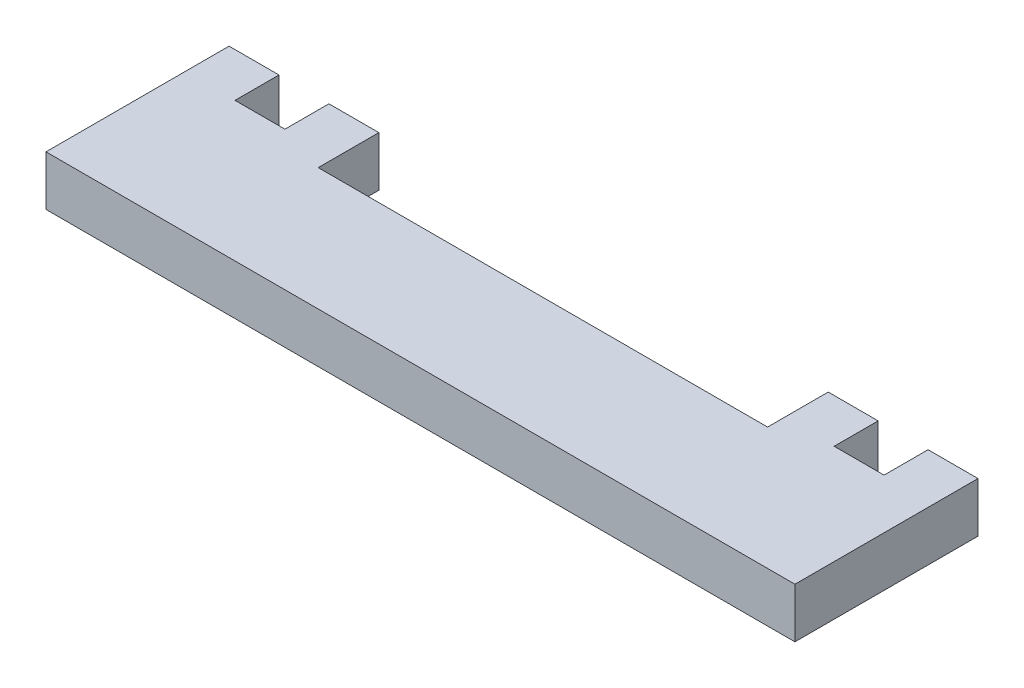
ISO-10303-21;
HEADER;
FILE_DESCRIPTION(('STEP AP214'),'2;1');
FILE_NAME('part.step','',(''),(''),'','','');
FILE_SCHEMA(('AUTOMOTIVE_DESIGN { 1 0 10303 214 1 1 1 1 }'));
ENDSEC;
DATA;
#1=APPLICATION_CONTEXT('core data for automotive mechanical design processes');
#2=APPLICATION_PROTOCOL_DEFINITION('international standard','automotive_design',2000,#1);
#3=PRODUCT_CONTEXT('',#1,'mechanical');
#4=PRODUCT('Part','Part','',(#3));
#5=PRODUCT_RELATED_PRODUCT_CATEGORY('part','',(#4));
#6=PRODUCT_DEFINITION_FORMATION('','',#4);
#7=PRODUCT_DEFINITION_CONTEXT('part definition',#1,'design');
#8=PRODUCT_DEFINITION('design','',#6,#7);
#9=PRODUCT_DEFINITION_SHAPE('','',#8);
#10=(LENGTH_UNIT() NAMED_UNIT(*) SI_UNIT(.MILLI.,.METRE.));
#11=(NAMED_UNIT(*) PLANE_ANGLE_UNIT() SI_UNIT($,.RADIAN.));
#12=(NAMED_UNIT(*) SI_UNIT($,.STERADIAN.) SOLID_ANGLE_UNIT());
#13=UNCERTAINTY_MEASURE_WITH_UNIT(LENGTH_MEASURE(1.E-05),#10,'distance_accuracy_value','');
#14=(GEOMETRIC_REPRESENTATION_CONTEXT(3) GLOBAL_UNCERTAINTY_ASSIGNED_CONTEXT((#13)) GLOBAL_UNIT_ASSIGNED_CONTEXT((#10,
#11,#12)) REPRESENTATION_CONTEXT('',''));
#15=CARTESIAN_POINT('',(0.,0.,0.));
#16=DIRECTION('',(0.,0.,1.));
#17=DIRECTION('',(1.,0.,0.));
#18=AXIS2_PLACEMENT_3D('',#15,#16,#17);
#19=CARTESIAN_POINT('',(13.5,3.,0.));
#20=DIRECTION('',(-1.,0.,0.));
#21=DIRECTION('',(0.,0.,1.));
#22=AXIS2_PLACEMENT_3D('',#19,#20,#21);
#23=PLANE('',#22);
#24=DIRECTION('',(0.,0.,-1.));
#25=VECTOR('',#24,1.);
#26=CARTESIAN_POINT('',(13.5,0.,0.));
#27=LINE('',#26,#25);
#28=CARTESIAN_POINT('',(13.5,0.,-3.35638413828951));
#29=VERTEX_POINT('',#28);
#30=CARTESIAN_POINT('',(13.5,0.,-7.00000000000001));
#31=VERTEX_POINT('',#30);
#32=EDGE_CURVE('E176',#29,#31,#27,.T.);
#33=ORIENTED_EDGE('',*,*,#32,.F.);
#34=DIRECTION('',(0.,-1.,0.));
#35=VECTOR('',#34,1.);
#36=CARTESIAN_POINT('',(13.5,3.,-3.35638413828951));
#37=LINE('',#36,#35);
#38=CARTESIAN_POINT('',(13.5,3.,-3.35638413828951));
#39=VERTEX_POINT('',#38);
#40=EDGE_CURVE('E11',#39,#29,#37,.T.);
#41=ORIENTED_EDGE('',*,*,#40,.F.);
#42=DIRECTION('',(0.,0.,-1.));
#43=VECTOR('',#42,1.);
#44=CARTESIAN_POINT('',(13.5,3.,0.));
#45=LINE('',#44,#43);
#46=CARTESIAN_POINT('',(13.5,3.,-7.00000000000001));
#47=VERTEX_POINT('',#46);
#48=EDGE_CURVE('E217',#39,#47,#45,.T.);
#49=ORIENTED_EDGE('',*,*,#48,.T.);
#50=DIRECTION('',(0.,-1.,0.));
#51=VECTOR('',#50,1.);
#52=CARTESIAN_POINT('',(13.5,3.,-7.00000000000001));
#53=LINE('',#52,#51);
#54=EDGE_CURVE('E109',#47,#31,#53,.T.);
#55=ORIENTED_EDGE('',*,*,#54,.T.);
#56=EDGE_LOOP('',(#33,#41,#49,#55));
#57=FACE_BOUND('',#56,.T.);
#58=ADVANCED_FACE('F35',(#57),#23,.T.);
#59=CARTESIAN_POINT('',(0.,3.,-3.35638413828951));
#60=DIRECTION('',(0.,0.,-1.));
#61=DIRECTION('',(-1.,0.,0.));
#62=AXIS2_PLACEMENT_3D('',#59,#60,#61);
#63=PLANE('',#62);
#64=DIRECTION('',(1.,0.,0.));
#65=VECTOR('',#64,1.);
#66=CARTESIAN_POINT('',(0.,0.,-3.35638413828951));
#67=LINE('',#66,#65);
#68=CARTESIAN_POINT('',(-13.5,0.,-3.35638413828951));
#69=VERTEX_POINT('',#68);
#70=EDGE_CURVE('E179',#69,#29,#67,.T.);
#71=ORIENTED_EDGE('',*,*,#70,.F.);
#72=DIRECTION('',(0.,-1.,0.));
#73=VECTOR('',#72,1.);
#74=CARTESIAN_POINT('',(-13.5,3.,-3.35638413828951));
#75=LINE('',#74,#73);
#76=CARTESIAN_POINT('',(-13.5,3.,-3.35638413828951));
#77=VERTEX_POINT('',#76);
#78=EDGE_CURVE('E43',#77,#69,#75,.T.);
#79=ORIENTED_EDGE('',*,*,#78,.F.);
#80=DIRECTION('',(1.,0.,0.));
#81=VECTOR('',#80,1.);
#82=CARTESIAN_POINT('',(0.,3.,-3.35638413828951));
#83=LINE('',#82,#81);
#84=EDGE_CURVE('E264',#77,#39,#83,.T.);
#85=ORIENTED_EDGE('',*,*,#84,.T.);
#86=ORIENTED_EDGE('',*,*,#40,.T.);
#87=EDGE_LOOP('',(#71,#79,#85,#86));
#88=FACE_BOUND('',#87,.T.);
#89=ADVANCED_FACE('F252',(#88),#63,.T.);
#90=CARTESIAN_POINT('',(-13.5,3.,0.));
#91=DIRECTION('',(1.,0.,0.));
#92=DIRECTION('',(0.,0.,-1.));
#93=AXIS2_PLACEMENT_3D('',#90,#91,#92);
#94=PLANE('',#93);
#95=DIRECTION('',(0.,0.,1.));
#96=VECTOR('',#95,1.);
#97=CARTESIAN_POINT('',(-13.5,0.,0.));
#98=LINE('',#97,#96);
#99=CARTESIAN_POINT('',(-13.5,0.,-7.00000000000001));
#100=VERTEX_POINT('',#99);
#101=EDGE_CURVE('E182',#100,#69,#98,.T.);
#102=ORIENTED_EDGE('',*,*,#101,.F.);
#103=DIRECTION('',(0.,-1.,0.));
#104=VECTOR('',#103,1.);
#105=CARTESIAN_POINT('',(-13.5,3.,-7.00000000000001));
#106=LINE('',#105,#104);
#107=CARTESIAN_POINT('',(-13.5,3.,-7.00000000000001));
#108=VERTEX_POINT('',#107);
#109=EDGE_CURVE('E241',#108,#100,#106,.T.);
#110=ORIENTED_EDGE('',*,*,#109,.F.);
#111=DIRECTION('',(0.,0.,1.));
#112=VECTOR('',#111,1.);
#113=CARTESIAN_POINT('',(-13.5,3.,0.));
#114=LINE('',#113,#112);
#115=EDGE_CURVE('E248',#108,#77,#114,.T.);
#116=ORIENTED_EDGE('',*,*,#115,.T.);
#117=ORIENTED_EDGE('',*,*,#78,.T.);
#118=EDGE_LOOP('',(#102,#110,#116,#117));
#119=FACE_BOUND('',#118,.T.);
#120=ADVANCED_FACE('F246',(#119),#94,.T.);
#121=CARTESIAN_POINT('',(0.,3.,-7.00000000000001));
#122=DIRECTION('',(0.,0.,-1.));
#123=DIRECTION('',(-1.,0.,0.));
#124=AXIS2_PLACEMENT_3D('',#121,#122,#123);
#125=PLANE('',#124);
#126=DIRECTION('',(1.,0.,0.));
#127=VECTOR('',#126,1.);
#128=CARTESIAN_POINT('',(0.,0.,-7.00000000000001));
#129=LINE('',#128,#127);
#130=CARTESIAN_POINT('',(-16.5,0.,-7.00000000000001));
#131=VERTEX_POINT('',#130);
#132=EDGE_CURVE('E185',#131,#100,#129,.T.);
#133=ORIENTED_EDGE('',*,*,#132,.F.);
#134=DIRECTION('',(0.,-1.,0.));
#135=VECTOR('',#134,1.);
#136=CARTESIAN_POINT('',(-16.5,3.,-7.00000000000001));
#137=LINE('',#136,#135);
#138=CARTESIAN_POINT('',(-16.5,3.,-7.00000000000001));
#139=VERTEX_POINT('',#138);
#140=EDGE_CURVE('E239',#139,#131,#137,.T.);
#141=ORIENTED_EDGE('',*,*,#140,.F.);
#142=DIRECTION('',(1.,0.,0.));
#143=VECTOR('',#142,1.);
#144=CARTESIAN_POINT('',(0.,3.,-7.00000000000001));
#145=LINE('',#144,#143);
#146=EDGE_CURVE('E261',#139,#108,#145,.T.);
#147=ORIENTED_EDGE('',*,*,#146,.T.);
#148=ORIENTED_EDGE('',*,*,#109,.T.);
#149=EDGE_LOOP('',(#133,#141,#147,#148));
#150=FACE_BOUND('',#149,.T.);
#151=ADVANCED_FACE('F258',(#150),#125,.T.);
#152=CARTESIAN_POINT('',(-16.5,3.,0.));
#153=DIRECTION('',(-1.,0.,0.));
#154=DIRECTION('',(0.,0.,1.));
#155=AXIS2_PLACEMENT_3D('',#152,#153,#154);
#156=PLANE('',#155);
#157=DIRECTION('',(0.,0.,-1.));
#158=VECTOR('',#157,1.);
#159=CARTESIAN_POINT('',(-16.5,0.,0.));
#160=LINE('',#159,#158);
#161=CARTESIAN_POINT('',(-16.5,0.,-4.35638413828951));
#162=VERTEX_POINT('',#161);
#163=EDGE_CURVE('E188',#162,#131,#160,.T.);
#164=ORIENTED_EDGE('',*,*,#163,.F.);
#165=DIRECTION('',(0.,-1.,0.));
#166=VECTOR('',#165,1.);
#167=CARTESIAN_POINT('',(-16.5,3.,-4.35638413828951));
#168=LINE('',#167,#166);
#169=CARTESIAN_POINT('',(-16.5,3.,-4.35638413828951));
#170=VERTEX_POINT('',#169);
#171=EDGE_CURVE('E237',#170,#162,#168,.T.);
#172=ORIENTED_EDGE('',*,*,#171,.F.);
#173=DIRECTION('',(0.,0.,-1.));
#174=VECTOR('',#173,1.);
#175=CARTESIAN_POINT('',(-16.5,3.,0.));
#176=LINE('',#175,#174);
#177=EDGE_CURVE('E266',#170,#139,#176,.T.);
#178=ORIENTED_EDGE('',*,*,#177,.T.);
#179=ORIENTED_EDGE('',*,*,#140,.T.);
#180=EDGE_LOOP('',(#164,#172,#178,#179));
#181=FACE_BOUND('',#180,.T.);
#182=ADVANCED_FACE('F310',(#181),#156,.T.);
#183=CARTESIAN_POINT('',(0.,3.,-4.35638413828951));
#184=DIRECTION('',(0.,0.,-1.));
#185=DIRECTION('',(-1.,0.,0.));
#186=AXIS2_PLACEMENT_3D('',#183,#184,#185);
#187=PLANE('',#186);
#188=DIRECTION('',(1.,0.,0.));
#189=VECTOR('',#188,1.);
#190=CARTESIAN_POINT('',(0.,0.,-4.35638413828951));
#191=LINE('',#190,#189);
#192=CARTESIAN_POINT('',(-19.5,0.,-4.35638413828951));
#193=VERTEX_POINT('',#192);
#194=EDGE_CURVE('E191',#193,#162,#191,.T.);
#195=ORIENTED_EDGE('',*,*,#194,.F.);
#196=DIRECTION('',(0.,-1.,0.));
#197=VECTOR('',#196,1.);
#198=CARTESIAN_POINT('',(-19.5,3.,-4.35638413828951));
#199=LINE('',#198,#197);
#200=CARTESIAN_POINT('',(-19.5,3.,-4.35638413828951));
#201=VERTEX_POINT('',#200);
#202=EDGE_CURVE('E235',#201,#193,#199,.T.);
#203=ORIENTED_EDGE('',*,*,#202,.F.);
#204=DIRECTION('',(1.,0.,0.));
#205=VECTOR('',#204,1.);
#206=CARTESIAN_POINT('',(0.,3.,-4.35638413828951));
#207=LINE('',#206,#205);
#208=EDGE_CURVE('E272',#201,#170,#207,.T.);
#209=ORIENTED_EDGE('',*,*,#208,.T.);
#210=ORIENTED_EDGE('',*,*,#171,.T.);
#211=EDGE_LOOP('',(#195,#203,#209,#210));
#212=FACE_BOUND('',#211,.T.);
#213=ADVANCED_FACE('F313',(#212),#187,.T.);
#214=CARTESIAN_POINT('',(-19.5,3.,0.));
#215=DIRECTION('',(-1.,0.,0.));
#216=DIRECTION('',(0.,0.,1.));
#217=AXIS2_PLACEMENT_3D('',#214,#215,#216);
#218=PLANE('',#217);
#219=DIRECTION('',(0.,0.,-1.));
#220=VECTOR('',#219,1.);
#221=CARTESIAN_POINT('',(-19.5,0.,0.));
#222=LINE('',#221,#220);
#223=CARTESIAN_POINT('',(-19.5,0.,-7.00000000000001));
#224=VERTEX_POINT('',#223);
#225=EDGE_CURVE('E194',#193,#224,#222,.T.);
#226=ORIENTED_EDGE('',*,*,#225,.T.);
#227=DIRECTION('',(0.,-1.,0.));
#228=VECTOR('',#227,1.);
#229=CARTESIAN_POINT('',(-19.5,3.,-7.00000000000001));
#230=LINE('',#229,#228);
#231=CARTESIAN_POINT('',(-19.5,3.,-7.00000000000001));
#232=VERTEX_POINT('',#231);
#233=EDGE_CURVE('E233',#232,#224,#230,.T.);
#234=ORIENTED_EDGE('',*,*,#233,.F.);
#235=DIRECTION('',(0.,0.,-1.));
#236=VECTOR('',#235,1.);
#237=CARTESIAN_POINT('',(-19.5,3.,0.));
#238=LINE('',#237,#236);
#239=EDGE_CURVE('E275',#201,#232,#238,.T.);
#240=ORIENTED_EDGE('',*,*,#239,.F.);
#241=ORIENTED_EDGE('',*,*,#202,.T.);
#242=EDGE_LOOP('',(#226,#234,#240,#241));
#243=FACE_BOUND('',#242,.T.);
#244=ADVANCED_FACE('F317',(#243),#218,.F.);
#245=CARTESIAN_POINT('',(0.,3.,-7.00000000000001));
#246=DIRECTION('',(0.,0.,-1.));
#247=DIRECTION('',(-1.,0.,0.));
#248=AXIS2_PLACEMENT_3D('',#245,#246,#247);
#249=PLANE('',#248);
#250=DIRECTION('',(1.,0.,0.));
#251=VECTOR('',#250,1.);
#252=CARTESIAN_POINT('',(0.,0.,-7.00000000000001));
#253=LINE('',#252,#251);
#254=CARTESIAN_POINT('',(-22.5,0.,-7.00000000000001));
#255=VERTEX_POINT('',#254);
#256=EDGE_CURVE('E197',#255,#224,#253,.T.);
#257=ORIENTED_EDGE('',*,*,#256,.F.);
#258=DIRECTION('',(0.,-1.,0.));
#259=VECTOR('',#258,1.);
#260=CARTESIAN_POINT('',(-22.5,3.,-7.00000000000001));
#261=LINE('',#260,#259);
#262=CARTESIAN_POINT('',(-22.5,3.,-7.00000000000001));
#263=VERTEX_POINT('',#262);
#264=EDGE_CURVE('E231',#263,#255,#261,.T.);
#265=ORIENTED_EDGE('',*,*,#264,.F.);
#266=DIRECTION('',(1.,0.,0.));
#267=VECTOR('',#266,1.);
#268=CARTESIAN_POINT('',(0.,3.,-7.00000000000001));
#269=LINE('',#268,#267);
#270=EDGE_CURVE('E277',#263,#232,#269,.T.);
#271=ORIENTED_EDGE('',*,*,#270,.T.);
#272=ORIENTED_EDGE('',*,*,#233,.T.);
#273=EDGE_LOOP('',(#257,#265,#271,#272));
#274=FACE_BOUND('',#273,.T.);
#275=ADVANCED_FACE('F321',(#274),#249,.T.);
#276=CARTESIAN_POINT('',(-22.5,3.,0.));
#277=DIRECTION('',(-1.,0.,0.));
#278=DIRECTION('',(0.,0.,1.));
#279=AXIS2_PLACEMENT_3D('',#276,#277,#278);
#280=PLANE('',#279);
#281=DIRECTION('',(0.,0.,-1.));
#282=VECTOR('',#281,1.);
#283=CARTESIAN_POINT('',(-22.5,0.,0.));
#284=LINE('',#283,#282);
#285=CARTESIAN_POINT('',(-22.5,0.,3.99999999999999));
#286=VERTEX_POINT('',#285);
#287=EDGE_CURVE('E200',#286,#255,#284,.T.);
#288=ORIENTED_EDGE('',*,*,#287,.F.);
#289=DIRECTION('',(0.,-1.,0.));
#290=VECTOR('',#289,1.);
#291=CARTESIAN_POINT('',(-22.5,3.,3.99999999999999));
#292=LINE('',#291,#290);
#293=CARTESIAN_POINT('',(-22.5,3.,3.99999999999999));
#294=VERTEX_POINT('',#293);
#295=EDGE_CURVE('E229',#294,#286,#292,.T.);
#296=ORIENTED_EDGE('',*,*,#295,.F.);
#297=DIRECTION('',(0.,0.,-1.));
#298=VECTOR('',#297,1.);
#299=CARTESIAN_POINT('',(-22.5,3.,0.));
#300=LINE('',#299,#298);
#301=EDGE_CURVE('E280',#294,#263,#300,.T.);
#302=ORIENTED_EDGE('',*,*,#301,.T.);
#303=ORIENTED_EDGE('',*,*,#264,.T.);
#304=EDGE_LOOP('',(#288,#296,#302,#303));
#305=FACE_BOUND('',#304,.T.);
#306=ADVANCED_FACE('F325',(#305),#280,.T.);
#307=CARTESIAN_POINT('',(0.,3.,4.));
#308=DIRECTION('',(0.,0.,-1.));
#309=DIRECTION('',(-1.,0.,0.));
#310=AXIS2_PLACEMENT_3D('',#307,#308,#309);
#311=PLANE('',#310);
#312=DIRECTION('',(1.,0.,0.));
#313=VECTOR('',#312,1.);
#314=CARTESIAN_POINT('',(0.,0.,4.));
#315=LINE('',#314,#313);
#316=CARTESIAN_POINT('',(22.5,0.,4.00000000000001));
#317=VERTEX_POINT('',#316);
#318=EDGE_CURVE('E203',#286,#317,#315,.T.);
#319=ORIENTED_EDGE('',*,*,#318,.T.);
#320=DIRECTION('',(0.,-1.,0.));
#321=VECTOR('',#320,1.);
#322=CARTESIAN_POINT('',(22.5,3.,4.00000000000001));
#323=LINE('',#322,#321);
#324=CARTESIAN_POINT('',(22.5,3.,4.00000000000001));
#325=VERTEX_POINT('',#324);
#326=EDGE_CURVE('E226',#325,#317,#323,.T.);
#327=ORIENTED_EDGE('',*,*,#326,.F.);
#328=DIRECTION('',(1.,0.,0.));
#329=VECTOR('',#328,1.);
#330=CARTESIAN_POINT('',(0.,3.,4.));
#331=LINE('',#330,#329);
#332=EDGE_CURVE('E283',#294,#325,#331,.T.);
#333=ORIENTED_EDGE('',*,*,#332,.F.);
#334=ORIENTED_EDGE('',*,*,#295,.T.);
#335=EDGE_LOOP('',(#319,#327,#333,#334));
#336=FACE_BOUND('',#335,.T.);
#337=ADVANCED_FACE('F329',(#336),#311,.F.);
#338=CARTESIAN_POINT('',(22.5,3.,0.));
#339=DIRECTION('',(-1.,0.,0.));
#340=DIRECTION('',(0.,0.,1.));
#341=AXIS2_PLACEMENT_3D('',#338,#339,#340);
#342=PLANE('',#341);
#343=DIRECTION('',(0.,0.,-1.));
#344=VECTOR('',#343,1.);
#345=CARTESIAN_POINT('',(22.5,0.,0.));
#346=LINE('',#345,#344);
#347=CARTESIAN_POINT('',(22.5,0.,-7.00000000000001));
#348=VERTEX_POINT('',#347);
#349=EDGE_CURVE('E205',#317,#348,#346,.T.);
#350=ORIENTED_EDGE('',*,*,#349,.T.);
#351=DIRECTION('',(0.,-1.,0.));
#352=VECTOR('',#351,1.);
#353=CARTESIAN_POINT('',(22.5,3.,-7.00000000000001));
#354=LINE('',#353,#352);
#355=CARTESIAN_POINT('',(22.5,3.,-7.00000000000001));
#356=VERTEX_POINT('',#355);
#357=EDGE_CURVE('E223',#356,#348,#354,.T.);
#358=ORIENTED_EDGE('',*,*,#357,.F.);
#359=DIRECTION('',(0.,0.,-1.));
#360=VECTOR('',#359,1.);
#361=CARTESIAN_POINT('',(22.5,3.,0.));
#362=LINE('',#361,#360);
#363=EDGE_CURVE('E285',#325,#356,#362,.T.);
#364=ORIENTED_EDGE('',*,*,#363,.F.);
#365=ORIENTED_EDGE('',*,*,#326,.T.);
#366=EDGE_LOOP('',(#350,#358,#364,#365));
#367=FACE_BOUND('',#366,.T.);
#368=ADVANCED_FACE('F333',(#367),#342,.F.);
#369=CARTESIAN_POINT('',(0.,3.,-7.00000000000001));
#370=DIRECTION('',(0.,0.,1.));
#371=DIRECTION('',(1.,0.,0.));
#372=AXIS2_PLACEMENT_3D('',#369,#370,#371);
#373=PLANE('',#372);
#374=DIRECTION('',(-1.,0.,0.));
#375=VECTOR('',#374,1.);
#376=CARTESIAN_POINT('',(0.,0.,-7.00000000000001));
#377=LINE('',#376,#375);
#378=CARTESIAN_POINT('',(19.5,0.,-7.00000000000001));
#379=VERTEX_POINT('',#378);
#380=EDGE_CURVE('E207',#348,#379,#377,.T.);
#381=ORIENTED_EDGE('',*,*,#380,.T.);
#382=DIRECTION('',(0.,-1.,0.));
#383=VECTOR('',#382,1.);
#384=CARTESIAN_POINT('',(19.5,3.,-7.00000000000001));
#385=LINE('',#384,#383);
#386=CARTESIAN_POINT('',(19.5,3.,-7.00000000000001));
#387=VERTEX_POINT('',#386);
#388=EDGE_CURVE('E221',#387,#379,#385,.T.);
#389=ORIENTED_EDGE('',*,*,#388,.F.);
#390=DIRECTION('',(-1.,0.,0.));
#391=VECTOR('',#390,1.);
#392=CARTESIAN_POINT('',(0.,3.,-7.00000000000001));
#393=LINE('',#392,#391);
#394=EDGE_CURVE('E171',#356,#387,#393,.T.);
#395=ORIENTED_EDGE('',*,*,#394,.F.);
#396=ORIENTED_EDGE('',*,*,#357,.T.);
#397=EDGE_LOOP('',(#381,#389,#395,#396));
#398=FACE_BOUND('',#397,.T.);
#399=ADVANCED_FACE('F291',(#398),#373,.F.);
#400=CARTESIAN_POINT('',(19.5,3.,0.));
#401=DIRECTION('',(-1.,0.,0.));
#402=DIRECTION('',(0.,0.,1.));
#403=AXIS2_PLACEMENT_3D('',#400,#401,#402);
#404=PLANE('',#403);
#405=DIRECTION('',(0.,0.,-1.));
#406=VECTOR('',#405,1.);
#407=CARTESIAN_POINT('',(19.5,0.,0.));
#408=LINE('',#407,#406);
#409=CARTESIAN_POINT('',(19.5,0.,-4.35638413828951));
#410=VERTEX_POINT('',#409);
#411=EDGE_CURVE('E210',#410,#379,#408,.T.);
#412=ORIENTED_EDGE('',*,*,#411,.F.);
#413=DIRECTION('',(0.,-1.,0.));
#414=VECTOR('',#413,1.);
#415=CARTESIAN_POINT('',(19.5,3.,-4.35638413828951));
#416=LINE('',#415,#414);
#417=CARTESIAN_POINT('',(19.5,3.,-4.35638413828951));
#418=VERTEX_POINT('',#417);
#419=EDGE_CURVE('E160',#418,#410,#416,.T.);
#420=ORIENTED_EDGE('',*,*,#419,.F.);
#421=DIRECTION('',(0.,0.,-1.));
#422=VECTOR('',#421,1.);
#423=CARTESIAN_POINT('',(19.5,3.,0.));
#424=LINE('',#423,#422);
#425=EDGE_CURVE('E169',#418,#387,#424,.T.);
#426=ORIENTED_EDGE('',*,*,#425,.T.);
#427=ORIENTED_EDGE('',*,*,#388,.T.);
#428=EDGE_LOOP('',(#412,#420,#426,#427));
#429=FACE_BOUND('',#428,.T.);
#430=ADVANCED_FACE('F295',(#429),#404,.T.);
#431=CARTESIAN_POINT('',(0.,3.,-4.35638413828951));
#432=DIRECTION('',(0.,0.,-1.));
#433=DIRECTION('',(-1.,0.,0.));
#434=AXIS2_PLACEMENT_3D('',#431,#432,#433);
#435=PLANE('',#434);
#436=DIRECTION('',(1.,0.,0.));
#437=VECTOR('',#436,1.);
#438=CARTESIAN_POINT('',(0.,0.,-4.35638413828951));
#439=LINE('',#438,#437);
#440=CARTESIAN_POINT('',(16.5,0.,-4.35638413828951));
#441=VERTEX_POINT('',#440);
#442=EDGE_CURVE('E159',#441,#410,#439,.T.);
#443=ORIENTED_EDGE('',*,*,#442,.F.);
#444=DIRECTION('',(0.,-1.,0.));
#445=VECTOR('',#444,1.);
#446=CARTESIAN_POINT('',(16.5,3.,-4.35638413828951));
#447=LINE('',#446,#445);
#448=CARTESIAN_POINT('',(16.5,3.,-4.35638413828951));
#449=VERTEX_POINT('',#448);
#450=EDGE_CURVE('E153',#449,#441,#447,.T.);
#451=ORIENTED_EDGE('',*,*,#450,.F.);
#452=DIRECTION('',(1.,0.,0.));
#453=VECTOR('',#452,1.);
#454=CARTESIAN_POINT('',(0.,3.,-4.35638413828951));
#455=LINE('',#454,#453);
#456=EDGE_CURVE('E157',#449,#418,#455,.T.);
#457=ORIENTED_EDGE('',*,*,#456,.T.);
#458=ORIENTED_EDGE('',*,*,#419,.T.);
#459=EDGE_LOOP('',(#443,#451,#457,#458));
#460=FACE_BOUND('',#459,.T.);
#461=ADVANCED_FACE('F155',(#460),#435,.T.);
#462=CARTESIAN_POINT('',(16.5,3.,0.));
#463=DIRECTION('',(-1.,0.,0.));
#464=DIRECTION('',(0.,0.,1.));
#465=AXIS2_PLACEMENT_3D('',#462,#463,#464);
#466=PLANE('',#465);
#467=DIRECTION('',(0.,0.,-1.));
#468=VECTOR('',#467,1.);
#469=CARTESIAN_POINT('',(16.5,0.,0.));
#470=LINE('',#469,#468);
#471=CARTESIAN_POINT('',(16.5,0.,-7.00000000000001));
#472=VERTEX_POINT('',#471);
#473=EDGE_CURVE('E102',#441,#472,#470,.T.);
#474=ORIENTED_EDGE('',*,*,#473,.T.);
#475=DIRECTION('',(0.,-1.,0.));
#476=VECTOR('',#475,1.);
#477=CARTESIAN_POINT('',(16.5,3.,-7.00000000000001));
#478=LINE('',#477,#476);
#479=CARTESIAN_POINT('',(16.5,3.,-7.00000000000001));
#480=VERTEX_POINT('',#479);
#481=EDGE_CURVE('E161',#480,#472,#478,.T.);
#482=ORIENTED_EDGE('',*,*,#481,.F.);
#483=DIRECTION('',(0.,0.,-1.));
#484=VECTOR('',#483,1.);
#485=CARTESIAN_POINT('',(16.5,3.,0.));
#486=LINE('',#485,#484);
#487=EDGE_CURVE('E163',#449,#480,#486,.T.);
#488=ORIENTED_EDGE('',*,*,#487,.F.);
#489=ORIENTED_EDGE('',*,*,#450,.T.);
#490=EDGE_LOOP('',(#474,#482,#488,#489));
#491=FACE_BOUND('',#490,.T.);
#492=ADVANCED_FACE('F164',(#491),#466,.F.);
#493=CARTESIAN_POINT('',(0.,3.,-7.00000000000001));
#494=DIRECTION('',(0.,0.,1.));
#495=DIRECTION('',(1.,0.,0.));
#496=AXIS2_PLACEMENT_3D('',#493,#494,#495);
#497=PLANE('',#496);
#498=DIRECTION('',(-1.,0.,0.));
#499=VECTOR('',#498,1.);
#500=CARTESIAN_POINT('',(0.,0.,-7.00000000000001));
#501=LINE('',#500,#499);
#502=EDGE_CURVE('E215',#472,#31,#501,.T.);
#503=ORIENTED_EDGE('',*,*,#502,.T.);
#504=ORIENTED_EDGE('',*,*,#54,.F.);
#505=DIRECTION('',(-1.,0.,0.));
#506=VECTOR('',#505,1.);
#507=CARTESIAN_POINT('',(0.,3.,-7.00000000000001));
#508=LINE('',#507,#506);
#509=EDGE_CURVE('E51',#480,#47,#508,.T.);
#510=ORIENTED_EDGE('',*,*,#509,.F.);
#511=ORIENTED_EDGE('',*,*,#481,.T.);
#512=EDGE_LOOP('',(#503,#504,#510,#511));
#513=FACE_BOUND('',#512,.T.);
#514=ADVANCED_FACE('F298',(#513),#497,.F.);
#515=CARTESIAN_POINT('',(0.,3.,0.));
#516=DIRECTION('',(0.,1.,0.));
#517=DIRECTION('',(0.,0.,1.));
#518=AXIS2_PLACEMENT_3D('',#515,#516,#517);
#519=PLANE('',#518);
#520=ORIENTED_EDGE('',*,*,#48,.F.);
#521=ORIENTED_EDGE('',*,*,#84,.F.);
#522=ORIENTED_EDGE('',*,*,#115,.F.);
#523=ORIENTED_EDGE('',*,*,#146,.F.);
#524=ORIENTED_EDGE('',*,*,#177,.F.);
#525=ORIENTED_EDGE('',*,*,#208,.F.);
#526=ORIENTED_EDGE('',*,*,#239,.T.);
#527=ORIENTED_EDGE('',*,*,#270,.F.);
#528=ORIENTED_EDGE('',*,*,#301,.F.);
#529=ORIENTED_EDGE('',*,*,#332,.T.);
#530=ORIENTED_EDGE('',*,*,#363,.T.);
#531=ORIENTED_EDGE('',*,*,#394,.T.);
#532=ORIENTED_EDGE('',*,*,#425,.F.);
#533=ORIENTED_EDGE('',*,*,#456,.F.);
#534=ORIENTED_EDGE('',*,*,#487,.T.);
#535=ORIENTED_EDGE('',*,*,#509,.T.);
#536=EDGE_LOOP('',(#520,#521,#522,#523,#524,#525,#526,#527,#528,#529,#530,#531,#532,#533,#534,#535));
#537=FACE_BOUND('',#536,.T.);
#538=ADVANCED_FACE('F167',(#537),#519,.T.);
#539=CARTESIAN_POINT('',(0.,0.,0.));
#540=DIRECTION('',(0.,1.,0.));
#541=DIRECTION('',(0.,0.,1.));
#542=AXIS2_PLACEMENT_3D('',#539,#540,#541);
#543=PLANE('',#542);
#544=ORIENTED_EDGE('',*,*,#32,.T.);
#545=ORIENTED_EDGE('',*,*,#502,.F.);
#546=ORIENTED_EDGE('',*,*,#473,.F.);
#547=ORIENTED_EDGE('',*,*,#442,.T.);
#548=ORIENTED_EDGE('',*,*,#411,.T.);
#549=ORIENTED_EDGE('',*,*,#380,.F.);
#550=ORIENTED_EDGE('',*,*,#349,.F.);
#551=ORIENTED_EDGE('',*,*,#318,.F.);
#552=ORIENTED_EDGE('',*,*,#287,.T.);
#553=ORIENTED_EDGE('',*,*,#256,.T.);
#554=ORIENTED_EDGE('',*,*,#225,.F.);
#555=ORIENTED_EDGE('',*,*,#194,.T.);
#556=ORIENTED_EDGE('',*,*,#163,.T.);
#557=ORIENTED_EDGE('',*,*,#132,.T.);
#558=ORIENTED_EDGE('',*,*,#101,.T.);
#559=ORIENTED_EDGE('',*,*,#70,.T.);
#560=EDGE_LOOP('',(#544,#545,#546,#547,#548,#549,#550,#551,#552,#553,#554,#555,#556,#557,#558,#559));
#561=FACE_BOUND('',#560,.T.);
#562=ADVANCED_FACE('F254',(#561),#543,.F.);
#563=CLOSED_SHELL('',(#58,#89,#120,#151,#182,#213,#244,#275,#306,#337,#368,#399,#430,#461,#492,
#514,#538,#562));
#564=MANIFOLD_SOLID_BREP('B2',#563);
#565=ADVANCED_BREP_SHAPE_REPRESENTATION('',(#18,#564),#14);
#566=SHAPE_DEFINITION_REPRESENTATION(#9,#565);
ENDSEC;
END-ISO-10303-21;
